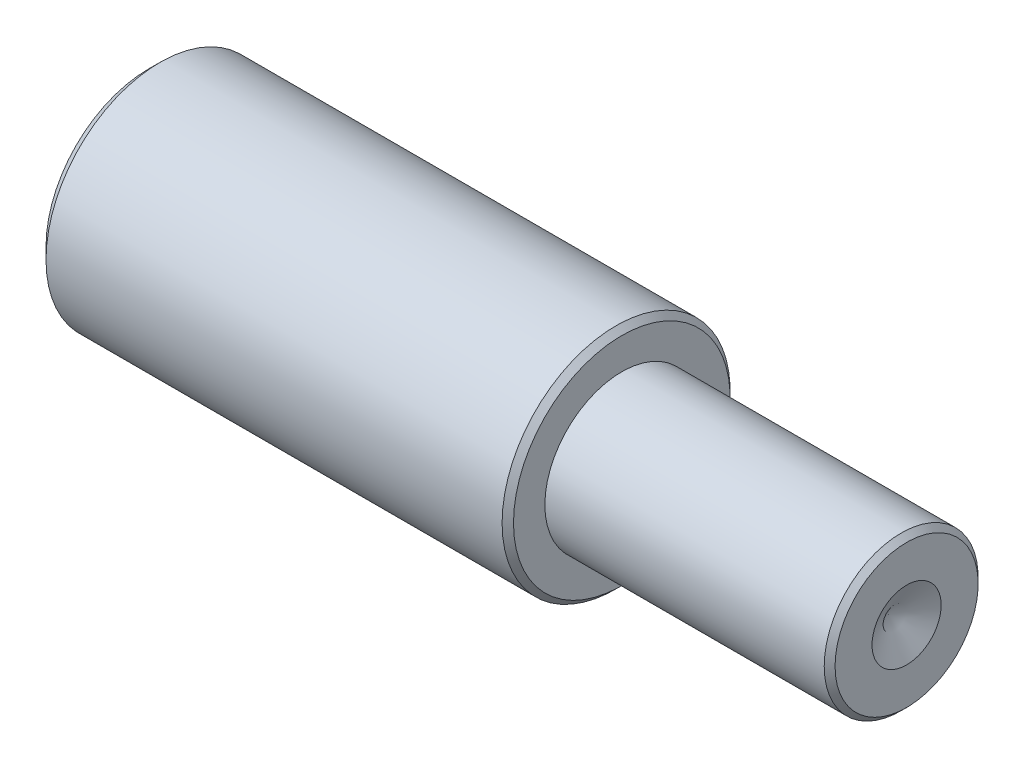
ISO-10303-21;
HEADER;
FILE_DESCRIPTION(('STEP AP214'),'2;1');
FILE_NAME('part.step','',(''),(''),'','','');
FILE_SCHEMA(('AUTOMOTIVE_DESIGN { 1 0 10303 214 1 1 1 1 }'));
ENDSEC;
DATA;
#1=APPLICATION_CONTEXT('core data for automotive mechanical design processes');
#2=APPLICATION_PROTOCOL_DEFINITION('international standard','automotive_design',2000,#1);
#3=PRODUCT_CONTEXT('',#1,'mechanical');
#4=PRODUCT('Part','Part','',(#3));
#5=PRODUCT_RELATED_PRODUCT_CATEGORY('part','',(#4));
#6=PRODUCT_DEFINITION_FORMATION('','',#4);
#7=PRODUCT_DEFINITION_CONTEXT('part definition',#1,'design');
#8=PRODUCT_DEFINITION('design','',#6,#7);
#9=PRODUCT_DEFINITION_SHAPE('','',#8);
#10=(LENGTH_UNIT() NAMED_UNIT(*) SI_UNIT(.MILLI.,.METRE.));
#11=(NAMED_UNIT(*) PLANE_ANGLE_UNIT() SI_UNIT($,.RADIAN.));
#12=(NAMED_UNIT(*) SI_UNIT($,.STERADIAN.) SOLID_ANGLE_UNIT());
#13=UNCERTAINTY_MEASURE_WITH_UNIT(LENGTH_MEASURE(1.E-05),#10,'distance_accuracy_value','');
#14=(GEOMETRIC_REPRESENTATION_CONTEXT(3) GLOBAL_UNCERTAINTY_ASSIGNED_CONTEXT((#13)) GLOBAL_UNIT_ASSIGNED_CONTEXT((#10,
#11,#12)) REPRESENTATION_CONTEXT('',''));
#15=CARTESIAN_POINT('',(0.,0.,0.));
#16=DIRECTION('',(0.,0.,1.));
#17=DIRECTION('',(1.,0.,0.));
#18=AXIS2_PLACEMENT_3D('',#15,#16,#17);
#19=CARTESIAN_POINT('',(-47.5274973026254,0.,-20.337527378994));
#20=DIRECTION('',(1.,0.,0.));
#21=DIRECTION('',(0.,0.,-1.));
#22=AXIS2_PLACEMENT_3D('',#19,#20,#21);
#23=PLANE('',#22);
#24=CARTESIAN_POINT('',(-47.5274973026254,0.,-2.337527378994));
#25=DIRECTION('',(-1.,0.,0.));
#26=DIRECTION('',(0.,0.,1.));
#27=AXIS2_PLACEMENT_3D('',#24,#25,#26);
#28=CIRCLE('',#27,18.);
#29=CARTESIAN_POINT('',(-47.5274973026254,0.,15.662472621006));
#30=VERTEX_POINT('',#29);
#31=EDGE_CURVE('E11',#30,#30,#28,.T.);
#32=ORIENTED_EDGE('',*,*,#31,.T.);
#33=EDGE_LOOP('',(#32));
#34=FACE_BOUND('',#33,.T.);
#35=ADVANCED_FACE('F35',(#34),#23,.F.);
#36=CARTESIAN_POINT('',(-45.5274973026254,0.,-2.337527378994));
#37=DIRECTION('',(1.,0.,0.));
#38=DIRECTION('',(0.,0.,-1.));
#39=AXIS2_PLACEMENT_3D('',#36,#37,#38);
#40=CONICAL_SURFACE('',#39,20.,0.78539816339745);
#41=ORIENTED_EDGE('',*,*,#31,.F.);
#42=EDGE_LOOP('',(#41));
#43=FACE_BOUND('',#42,.T.);
#44=CARTESIAN_POINT('',(-45.5274973026254,0.,-2.337527378994));
#45=DIRECTION('',(-1.,0.,0.));
#46=DIRECTION('',(0.,0.,1.));
#47=AXIS2_PLACEMENT_3D('',#44,#45,#46);
#48=CIRCLE('',#47,20.);
#49=CARTESIAN_POINT('',(-45.5274973026254,0.,17.662472621006));
#50=VERTEX_POINT('',#49);
#51=EDGE_CURVE('E41',#50,#50,#48,.T.);
#52=ORIENTED_EDGE('',*,*,#51,.T.);
#53=EDGE_LOOP('',(#52));
#54=FACE_BOUND('',#53,.T.);
#55=ADVANCED_FACE('F57',(#43,#54),#40,.T.);
#56=CARTESIAN_POINT('',(-58.6080417490214,0.,-2.337527378994));
#57=DIRECTION('',(-1.,0.,0.));
#58=DIRECTION('',(0.,0.,1.));
#59=AXIS2_PLACEMENT_3D('',#56,#57,#58);
#60=CYLINDRICAL_SURFACE('',#59,20.);
#61=ORIENTED_EDGE('',*,*,#51,.F.);
#62=EDGE_LOOP('',(#61));
#63=FACE_BOUND('',#62,.T.);
#64=CARTESIAN_POINT('',(34.4725026973746,0.,-2.337527378994));
#65=DIRECTION('',(-1.,0.,0.));
#66=DIRECTION('',(0.,0.,1.));
#67=AXIS2_PLACEMENT_3D('',#64,#65,#66);
#68=CIRCLE('',#67,20.);
#69=CARTESIAN_POINT('',(34.4725026973746,0.,17.662472621006));
#70=VERTEX_POINT('',#69);
#71=EDGE_CURVE('E69',#70,#70,#68,.T.);
#72=ORIENTED_EDGE('',*,*,#71,.T.);
#73=EDGE_LOOP('',(#72));
#74=FACE_BOUND('',#73,.T.);
#75=ADVANCED_FACE('F62',(#63,#74),#60,.T.);
#76=CARTESIAN_POINT('',(35.4725026973746,0.,-2.337527378994));
#77=DIRECTION('',(-1.,0.,0.));
#78=DIRECTION('',(0.,0.,1.));
#79=AXIS2_PLACEMENT_3D('',#76,#77,#78);
#80=CONICAL_SURFACE('',#79,19.,0.785398163397448);
#81=ORIENTED_EDGE('',*,*,#71,.F.);
#82=EDGE_LOOP('',(#81));
#83=FACE_BOUND('',#82,.T.);
#84=CARTESIAN_POINT('',(35.4725026973746,0.,-2.337527378994));
#85=DIRECTION('',(-1.,0.,0.));
#86=DIRECTION('',(0.,0.,1.));
#87=AXIS2_PLACEMENT_3D('',#84,#85,#86);
#88=CIRCLE('',#87,19.);
#89=CARTESIAN_POINT('',(35.4725026973746,0.,16.662472621006));
#90=VERTEX_POINT('',#89);
#91=EDGE_CURVE('E71',#90,#90,#88,.T.);
#92=ORIENTED_EDGE('',*,*,#91,.T.);
#93=EDGE_LOOP('',(#92));
#94=FACE_BOUND('',#93,.T.);
#95=ADVANCED_FACE('F104',(#83,#94),#80,.T.);
#96=CARTESIAN_POINT('',(35.4725026973746,0.,-21.337527378994));
#97=DIRECTION('',(-1.,0.,0.));
#98=DIRECTION('',(0.,0.,1.));
#99=AXIS2_PLACEMENT_3D('',#96,#97,#98);
#100=PLANE('',#99);
#101=ORIENTED_EDGE('',*,*,#91,.F.);
#102=EDGE_LOOP('',(#101));
#103=FACE_BOUND('',#102,.T.);
#104=CARTESIAN_POINT('',(35.4725026973746,0.,-2.337527378994));
#105=DIRECTION('',(-1.,0.,0.));
#106=DIRECTION('',(0.,0.,1.));
#107=AXIS2_PLACEMENT_3D('',#104,#105,#106);
#108=CIRCLE('',#107,13.5);
#109=CARTESIAN_POINT('',(35.4725026973746,0.,11.162472621006));
#110=VERTEX_POINT('',#109);
#111=EDGE_CURVE('E76',#110,#110,#108,.T.);
#112=ORIENTED_EDGE('',*,*,#111,.T.);
#113=EDGE_LOOP('',(#112));
#114=FACE_BOUND('',#113,.T.);
#115=ADVANCED_FACE('F97',(#103,#114),#100,.F.);
#116=CARTESIAN_POINT('',(-58.6080417490214,0.,-2.337527378994));
#117=DIRECTION('',(-1.,0.,0.));
#118=DIRECTION('',(0.,0.,1.));
#119=AXIS2_PLACEMENT_3D('',#116,#117,#118);
#120=CYLINDRICAL_SURFACE('',#119,13.5);
#121=ORIENTED_EDGE('',*,*,#111,.F.);
#122=EDGE_LOOP('',(#121));
#123=FACE_BOUND('',#122,.T.);
#124=CARTESIAN_POINT('',(84.4725026973746,0.,-2.337527378994));
#125=DIRECTION('',(-1.,0.,0.));
#126=DIRECTION('',(0.,0.,1.));
#127=AXIS2_PLACEMENT_3D('',#124,#125,#126);
#128=CIRCLE('',#127,13.5);
#129=CARTESIAN_POINT('',(84.4725026973746,0.,11.162472621006));
#130=VERTEX_POINT('',#129);
#131=EDGE_CURVE('E79',#130,#130,#128,.T.);
#132=ORIENTED_EDGE('',*,*,#131,.T.);
#133=EDGE_LOOP('',(#132));
#134=FACE_BOUND('',#133,.T.);
#135=ADVANCED_FACE('F91',(#123,#134),#120,.T.);
#136=CARTESIAN_POINT('',(85.4245465469575,0.,-2.337527378994));
#137=DIRECTION('',(-1.,0.,0.));
#138=DIRECTION('',(0.,0.,1.));
#139=AXIS2_PLACEMENT_3D('',#136,#137,#138);
#140=CONICAL_SURFACE('',#139,12.5479561504171,0.785398163397456);
#141=ORIENTED_EDGE('',*,*,#131,.F.);
#142=EDGE_LOOP('',(#141));
#143=FACE_BOUND('',#142,.T.);
#144=CARTESIAN_POINT('',(85.4245465469575,0.,-2.337527378994));
#145=DIRECTION('',(-1.,0.,0.));
#146=DIRECTION('',(0.,0.,1.));
#147=AXIS2_PLACEMENT_3D('',#144,#145,#146);
#148=CIRCLE('',#147,12.5479561504171);
#149=CARTESIAN_POINT('',(85.4245465469575,0.,10.2104287714231));
#150=VERTEX_POINT('',#149);
#151=EDGE_CURVE('E82',#150,#150,#148,.T.);
#152=ORIENTED_EDGE('',*,*,#151,.T.);
#153=EDGE_LOOP('',(#152));
#154=FACE_BOUND('',#153,.T.);
#155=ADVANCED_FACE('F52',(#143,#154),#140,.T.);
#156=CARTESIAN_POINT('',(85.4245465469575,0.,-14.8854835294111));
#157=DIRECTION('',(-1.,0.,0.));
#158=DIRECTION('',(0.,0.,1.));
#159=AXIS2_PLACEMENT_3D('',#156,#157,#158);
#160=PLANE('',#159);
#161=ORIENTED_EDGE('',*,*,#151,.F.);
#162=EDGE_LOOP('',(#161));
#163=FACE_BOUND('',#162,.T.);
#164=CARTESIAN_POINT('',(85.4245465469575,0.,-2.337527378994));
#165=DIRECTION('',(-1.,0.,0.));
#166=DIRECTION('',(0.,0.,1.));
#167=AXIS2_PLACEMENT_3D('',#164,#165,#166);
#168=CIRCLE('',#167,6.06332618401159);
#169=CARTESIAN_POINT('',(85.4245465469575,0.,3.72579880501759));
#170=VERTEX_POINT('',#169);
#171=EDGE_CURVE('E85',#170,#170,#168,.T.);
#172=ORIENTED_EDGE('',*,*,#171,.T.);
#173=EDGE_LOOP('',(#172));
#174=FACE_BOUND('',#173,.T.);
#175=ADVANCED_FACE('F46',(#163,#174),#160,.F.);
#176=CARTESIAN_POINT('',(82.259183131536,0.,-2.337527378994));
#177=DIRECTION('',(1.,0.,0.));
#178=DIRECTION('',(0.,0.,-1.));
#179=AXIS2_PLACEMENT_3D('',#176,#177,#178);
#180=CONICAL_SURFACE('',#179,0.,1.08966420815086);
#181=ORIENTED_EDGE('',*,*,#171,.F.);
#182=EDGE_LOOP('',(#181));
#183=FACE_BOUND('',#182,.T.);
#184=CARTESIAN_POINT('',(82.259183131536,0.,-2.337527378994));
#185=VERTEX_POINT('',#184);
#186=VERTEX_LOOP('',#185);
#187=FACE_BOUND('',#186,.T.);
#188=ADVANCED_FACE('F44',(#183,#187),#180,.F.);
#189=CLOSED_SHELL('',(#35,#55,#75,#95,#115,#135,#155,#175,#188));
#190=MANIFOLD_SOLID_BREP('B2',#189);
#191=ADVANCED_BREP_SHAPE_REPRESENTATION('',(#18,#190),#14);
#192=SHAPE_DEFINITION_REPRESENTATION(#9,#191);
ENDSEC;
END-ISO-10303-21;
